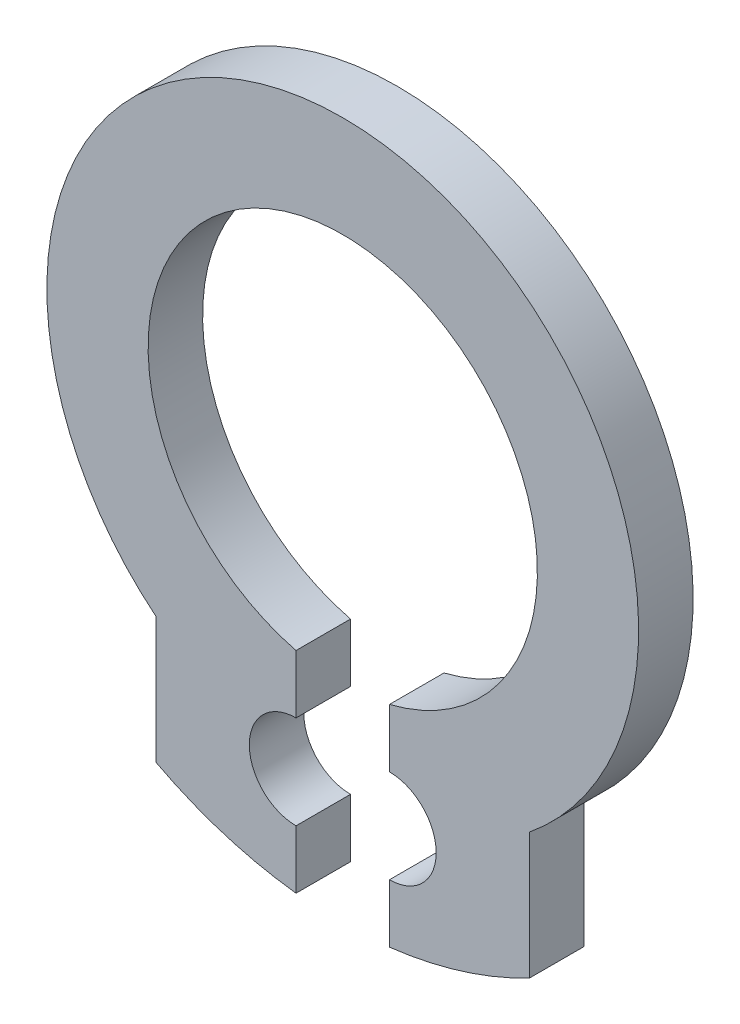
ISO-10303-21;
HEADER;
FILE_DESCRIPTION(('STEP AP214'),'2;1');
FILE_NAME('part.step','',(''),(''),'','','');
FILE_SCHEMA(('AUTOMOTIVE_DESIGN { 1 0 10303 214 1 1 1 1 }'));
ENDSEC;
DATA;
#1=APPLICATION_CONTEXT('core data for automotive mechanical design processes');
#2=APPLICATION_PROTOCOL_DEFINITION('international standard','automotive_design',2000,#1);
#3=PRODUCT_CONTEXT('',#1,'mechanical');
#4=PRODUCT('Part','Part','',(#3));
#5=PRODUCT_RELATED_PRODUCT_CATEGORY('part','',(#4));
#6=PRODUCT_DEFINITION_FORMATION('','',#4);
#7=PRODUCT_DEFINITION_CONTEXT('part definition',#1,'design');
#8=PRODUCT_DEFINITION('design','',#6,#7);
#9=PRODUCT_DEFINITION_SHAPE('','',#8);
#10=(LENGTH_UNIT() NAMED_UNIT(*) SI_UNIT(.MILLI.,.METRE.));
#11=(NAMED_UNIT(*) PLANE_ANGLE_UNIT() SI_UNIT($,.RADIAN.));
#12=(NAMED_UNIT(*) SI_UNIT($,.STERADIAN.) SOLID_ANGLE_UNIT());
#13=UNCERTAINTY_MEASURE_WITH_UNIT(LENGTH_MEASURE(1.E-05),#10,'distance_accuracy_value','');
#14=(GEOMETRIC_REPRESENTATION_CONTEXT(3) GLOBAL_UNCERTAINTY_ASSIGNED_CONTEXT((#13)) GLOBAL_UNIT_ASSIGNED_CONTEXT((#10,
#11,#12)) REPRESENTATION_CONTEXT('',''));
#15=CARTESIAN_POINT('',(0.,0.,0.));
#16=DIRECTION('',(0.,0.,1.));
#17=DIRECTION('',(1.,0.,0.));
#18=AXIS2_PLACEMENT_3D('',#15,#16,#17);
#19=CARTESIAN_POINT('',(0.,0.,0.));
#20=DIRECTION('',(0.,0.,1.));
#21=DIRECTION('',(1.,0.,0.));
#22=AXIS2_PLACEMENT_3D('',#19,#20,#21);
#23=PLANE('',#22);
#24=CARTESIAN_POINT('',(-0.6,5.126932219902,0.));
#25=DIRECTION('',(0.,0.,1.));
#26=DIRECTION('',(1.,0.,0.));
#27=AXIS2_PLACEMENT_3D('',#24,#25,#26);
#28=CIRCLE('',#27,2.5);
#29=CARTESIAN_POINT('',(0.,2.69999999999969,0.));
#30=VERTEX_POINT('',#29);
#31=CARTESIAN_POINT('',(-1.20000000000002,2.69999999999969,0.));
#32=VERTEX_POINT('',#31);
#33=EDGE_CURVE('E165',#30,#32,#28,.T.);
#34=ORIENTED_EDGE('',*,*,#33,.T.);
#35=DIRECTION('',(0.,1.,0.));
#36=VECTOR('',#35,1.);
#37=CARTESIAN_POINT('',(-1.2,0.,0.));
#38=LINE('',#37,#36);
#39=CARTESIAN_POINT('',(-1.2,1.95,0.));
#40=VERTEX_POINT('',#39);
#41=EDGE_CURVE('E129',#40,#32,#38,.T.);
#42=ORIENTED_EDGE('',*,*,#41,.F.);
#43=CARTESIAN_POINT('',(-1.2,1.35,0.));
#44=DIRECTION('',(0.,0.,1.));
#45=DIRECTION('',(1.,0.,0.));
#46=AXIS2_PLACEMENT_3D('',#43,#44,#45);
#47=CIRCLE('',#46,0.6);
#48=CARTESIAN_POINT('',(-1.2,0.75,0.));
#49=VERTEX_POINT('',#48);
#50=EDGE_CURVE('E167',#40,#49,#47,.T.);
#51=ORIENTED_EDGE('',*,*,#50,.T.);
#52=DIRECTION('',(0.,1.,0.));
#53=VECTOR('',#52,1.);
#54=CARTESIAN_POINT('',(-1.2,0.,0.));
#55=LINE('',#54,#53);
#56=CARTESIAN_POINT('',(-1.2,0.,0.));
#57=VERTEX_POINT('',#56);
#58=EDGE_CURVE('E132',#57,#49,#55,.T.);
#59=ORIENTED_EDGE('',*,*,#58,.F.);
#60=CARTESIAN_POINT('',(-0.6,5.126932219902,0.));
#61=DIRECTION('',(0.,0.,1.));
#62=DIRECTION('',(1.,0.,0.));
#63=AXIS2_PLACEMENT_3D('',#60,#61,#62);
#64=CIRCLE('',#63,5.161921540228);
#65=CARTESIAN_POINT('',(-3.,0.556873797138699,0.));
#66=VERTEX_POINT('',#65);
#67=EDGE_CURVE('E136',#66,#57,#64,.T.);
#68=ORIENTED_EDGE('',*,*,#67,.F.);
#69=DIRECTION('',(0.,1.,0.));
#70=VECTOR('',#69,1.);
#71=CARTESIAN_POINT('',(-3.,2.180748247371,0.));
#72=LINE('',#71,#70);
#73=CARTESIAN_POINT('',(-3.,2.18074824737081,0.));
#74=VERTEX_POINT('',#73);
#75=EDGE_CURVE('E137',#74,#66,#72,.F.);
#76=ORIENTED_EDGE('',*,*,#75,.F.);
#77=CARTESIAN_POINT('',(-0.6,5.126932219902,0.));
#78=DIRECTION('',(0.,0.,1.));
#79=DIRECTION('',(1.,0.,0.));
#80=AXIS2_PLACEMENT_3D('',#77,#78,#79);
#81=CIRCLE('',#80,3.8);
#82=CARTESIAN_POINT('',(1.80000000000003,2.18074824737078,0.));
#83=VERTEX_POINT('',#82);
#84=EDGE_CURVE('E172',#83,#74,#81,.T.);
#85=ORIENTED_EDGE('',*,*,#84,.F.);
#86=DIRECTION('',(0.,1.,0.));
#87=VECTOR('',#86,1.);
#88=CARTESIAN_POINT('',(1.8,0.5568737971387,0.));
#89=LINE('',#88,#87);
#90=CARTESIAN_POINT('',(1.8,0.556873797138699,0.));
#91=VERTEX_POINT('',#90);
#92=EDGE_CURVE('E141',#91,#83,#89,.T.);
#93=ORIENTED_EDGE('',*,*,#92,.F.);
#94=CARTESIAN_POINT('',(-0.6,5.126932219902,0.));
#95=DIRECTION('',(0.,0.,1.));
#96=DIRECTION('',(1.,0.,0.));
#97=AXIS2_PLACEMENT_3D('',#94,#95,#96);
#98=CIRCLE('',#97,5.161921540228);
#99=CARTESIAN_POINT('',(0.,0.,0.));
#100=VERTEX_POINT('',#99);
#101=EDGE_CURVE('E173',#100,#91,#98,.T.);
#102=ORIENTED_EDGE('',*,*,#101,.F.);
#103=DIRECTION('',(0.,1.,0.));
#104=VECTOR('',#103,1.);
#105=CARTESIAN_POINT('',(0.,2.7,0.));
#106=LINE('',#105,#104);
#107=CARTESIAN_POINT('',(0.,0.75,0.));
#108=VERTEX_POINT('',#107);
#109=EDGE_CURVE('E110',#108,#100,#106,.F.);
#110=ORIENTED_EDGE('',*,*,#109,.F.);
#111=CARTESIAN_POINT('',(0.,1.35,0.));
#112=DIRECTION('',(0.,0.,1.));
#113=DIRECTION('',(1.,0.,0.));
#114=AXIS2_PLACEMENT_3D('',#111,#112,#113);
#115=CIRCLE('',#114,0.6);
#116=CARTESIAN_POINT('',(0.,1.95,0.));
#117=VERTEX_POINT('',#116);
#118=EDGE_CURVE('E20',#108,#117,#115,.T.);
#119=ORIENTED_EDGE('',*,*,#118,.T.);
#120=DIRECTION('',(0.,1.,0.));
#121=VECTOR('',#120,1.);
#122=CARTESIAN_POINT('',(0.,2.7,0.));
#123=LINE('',#122,#121);
#124=EDGE_CURVE('E107',#30,#117,#123,.F.);
#125=ORIENTED_EDGE('',*,*,#124,.F.);
#126=EDGE_LOOP('',(#34,#42,#51,#59,#68,#76,#85,#93,#102,#110,#119,#125));
#127=FACE_BOUND('',#126,.T.);
#128=ADVANCED_FACE('F17',(#127),#23,.F.);
#129=CARTESIAN_POINT('',(0.,2.7,0.));
#130=DIRECTION('',(-1.,0.,0.));
#131=DIRECTION('',(0.,0.,1.));
#132=AXIS2_PLACEMENT_3D('',#129,#130,#131);
#133=PLANE('',#132);
#134=DIRECTION('',(0.,1.,0.));
#135=VECTOR('',#134,1.);
#136=CARTESIAN_POINT('',(0.,0.,0.7));
#137=LINE('',#136,#135);
#138=CARTESIAN_POINT('',(0.,2.69999999999969,0.7));
#139=VERTEX_POINT('',#138);
#140=CARTESIAN_POINT('',(0.,1.95,0.7));
#141=VERTEX_POINT('',#140);
#142=EDGE_CURVE('E164',#139,#141,#137,.F.);
#143=ORIENTED_EDGE('',*,*,#142,.F.);
#144=DIRECTION('',(0.,0.,1.));
#145=VECTOR('',#144,1.);
#146=CARTESIAN_POINT('',(0.,2.69999999999969,0.));
#147=LINE('',#146,#145);
#148=EDGE_CURVE('E119',#139,#30,#147,.F.);
#149=ORIENTED_EDGE('',*,*,#148,.T.);
#150=ORIENTED_EDGE('',*,*,#124,.T.);
#151=DIRECTION('',(0.,0.,1.));
#152=VECTOR('',#151,1.);
#153=CARTESIAN_POINT('',(0.,1.95,-0.07));
#154=LINE('',#153,#152);
#155=EDGE_CURVE('E113',#117,#141,#154,.T.);
#156=ORIENTED_EDGE('',*,*,#155,.T.);
#157=EDGE_LOOP('',(#143,#149,#150,#156));
#158=FACE_BOUND('',#157,.T.);
#159=ADVANCED_FACE('F116',(#158),#133,.T.);
#160=CARTESIAN_POINT('',(0.,1.35,-0.07));
#161=DIRECTION('',(0.,0.,1.));
#162=DIRECTION('',(1.,0.,0.));
#163=AXIS2_PLACEMENT_3D('',#160,#161,#162);
#164=CYLINDRICAL_SURFACE('',#163,0.6);
#165=ORIENTED_EDGE('',*,*,#118,.F.);
#166=DIRECTION('',(0.,0.,1.));
#167=VECTOR('',#166,1.);
#168=CARTESIAN_POINT('',(0.,0.75,0.));
#169=LINE('',#168,#167);
#170=CARTESIAN_POINT('',(0.,0.75,0.7));
#171=VERTEX_POINT('',#170);
#172=EDGE_CURVE('E112',#171,#108,#169,.F.);
#173=ORIENTED_EDGE('',*,*,#172,.F.);
#174=CARTESIAN_POINT('',(0.,1.35,0.7));
#175=DIRECTION('',(0.,0.,1.));
#176=DIRECTION('',(1.,0.,0.));
#177=AXIS2_PLACEMENT_3D('',#174,#175,#176);
#178=CIRCLE('',#177,0.6);
#179=EDGE_CURVE('E123',#141,#171,#178,.F.);
#180=ORIENTED_EDGE('',*,*,#179,.F.);
#181=ORIENTED_EDGE('',*,*,#155,.F.);
#182=EDGE_LOOP('',(#165,#173,#180,#181));
#183=FACE_BOUND('',#182,.T.);
#184=ADVANCED_FACE('F122',(#183),#164,.F.);
#185=CARTESIAN_POINT('',(0.,2.7,0.));
#186=DIRECTION('',(-1.,0.,0.));
#187=DIRECTION('',(0.,0.,1.));
#188=AXIS2_PLACEMENT_3D('',#185,#186,#187);
#189=PLANE('',#188);
#190=ORIENTED_EDGE('',*,*,#109,.T.);
#191=DIRECTION('',(0.,0.,1.));
#192=VECTOR('',#191,1.);
#193=CARTESIAN_POINT('',(0.,0.,0.));
#194=LINE('',#193,#192);
#195=CARTESIAN_POINT('',(0.,0.,0.7));
#196=VERTEX_POINT('',#195);
#197=EDGE_CURVE('E146',#196,#100,#194,.F.);
#198=ORIENTED_EDGE('',*,*,#197,.F.);
#199=DIRECTION('',(0.,1.,0.));
#200=VECTOR('',#199,1.);
#201=CARTESIAN_POINT('',(0.,0.,0.7));
#202=LINE('',#201,#200);
#203=EDGE_CURVE('E162',#171,#196,#202,.F.);
#204=ORIENTED_EDGE('',*,*,#203,.F.);
#205=ORIENTED_EDGE('',*,*,#172,.T.);
#206=EDGE_LOOP('',(#190,#198,#204,#205));
#207=FACE_BOUND('',#206,.T.);
#208=ADVANCED_FACE('F249',(#207),#189,.T.);
#209=CARTESIAN_POINT('',(-0.6,5.126932219902,0.));
#210=DIRECTION('',(0.,0.,1.));
#211=DIRECTION('',(1.,0.,0.));
#212=AXIS2_PLACEMENT_3D('',#209,#210,#211);
#213=CYLINDRICAL_SURFACE('',#212,5.161921540228);
#214=DIRECTION('',(0.,0.,-1.));
#215=VECTOR('',#214,1.);
#216=CARTESIAN_POINT('',(1.8,0.556873797138699,0.));
#217=LINE('',#216,#215);
#218=CARTESIAN_POINT('',(1.8,0.556873797138699,0.7));
#219=VERTEX_POINT('',#218);
#220=EDGE_CURVE('E145',#219,#91,#217,.T.);
#221=ORIENTED_EDGE('',*,*,#220,.F.);
#222=CARTESIAN_POINT('',(-0.6,5.126932219902,0.7));
#223=DIRECTION('',(0.,0.,1.));
#224=DIRECTION('',(1.,0.,0.));
#225=AXIS2_PLACEMENT_3D('',#222,#223,#224);
#226=CIRCLE('',#225,5.161921540228);
#227=EDGE_CURVE('E159',#196,#219,#226,.T.);
#228=ORIENTED_EDGE('',*,*,#227,.F.);
#229=ORIENTED_EDGE('',*,*,#197,.T.);
#230=ORIENTED_EDGE('',*,*,#101,.T.);
#231=EDGE_LOOP('',(#221,#228,#229,#230));
#232=FACE_BOUND('',#231,.T.);
#233=ADVANCED_FACE('F245',(#232),#213,.T.);
#234=CARTESIAN_POINT('',(1.8,0.5568737971387,0.));
#235=DIRECTION('',(1.,0.,0.));
#236=DIRECTION('',(0.,0.,-1.));
#237=AXIS2_PLACEMENT_3D('',#234,#235,#236);
#238=PLANE('',#237);
#239=DIRECTION('',(0.,0.,1.));
#240=VECTOR('',#239,1.);
#241=CARTESIAN_POINT('',(1.80000000000006,2.1807482473708,0.));
#242=LINE('',#241,#240);
#243=CARTESIAN_POINT('',(1.80000000000003,2.18074824737078,0.7));
#244=VERTEX_POINT('',#243);
#245=EDGE_CURVE('E144',#244,#83,#242,.F.);
#246=ORIENTED_EDGE('',*,*,#245,.F.);
#247=DIRECTION('',(0.,1.,0.));
#248=VECTOR('',#247,1.);
#249=CARTESIAN_POINT('',(1.8,0.,0.7));
#250=LINE('',#249,#248);
#251=EDGE_CURVE('E158',#219,#244,#250,.T.);
#252=ORIENTED_EDGE('',*,*,#251,.F.);
#253=ORIENTED_EDGE('',*,*,#220,.T.);
#254=ORIENTED_EDGE('',*,*,#92,.T.);
#255=EDGE_LOOP('',(#246,#252,#253,#254));
#256=FACE_BOUND('',#255,.T.);
#257=ADVANCED_FACE('F241',(#256),#238,.T.);
#258=CARTESIAN_POINT('',(-0.6,5.126932219902,0.));
#259=DIRECTION('',(0.,0.,1.));
#260=DIRECTION('',(1.,0.,0.));
#261=AXIS2_PLACEMENT_3D('',#258,#259,#260);
#262=CYLINDRICAL_SURFACE('',#261,3.8);
#263=DIRECTION('',(0.,0.,1.));
#264=VECTOR('',#263,1.);
#265=CARTESIAN_POINT('',(-3.,2.18074824737088,0.));
#266=LINE('',#265,#264);
#267=CARTESIAN_POINT('',(-3.,2.18074824737081,0.7));
#268=VERTEX_POINT('',#267);
#269=EDGE_CURVE('E140',#268,#74,#266,.F.);
#270=ORIENTED_EDGE('',*,*,#269,.F.);
#271=CARTESIAN_POINT('',(-0.6,5.126932219902,0.7));
#272=DIRECTION('',(0.,0.,1.));
#273=DIRECTION('',(1.,0.,0.));
#274=AXIS2_PLACEMENT_3D('',#271,#272,#273);
#275=CIRCLE('',#274,3.8);
#276=EDGE_CURVE('E156',#244,#268,#275,.T.);
#277=ORIENTED_EDGE('',*,*,#276,.F.);
#278=ORIENTED_EDGE('',*,*,#245,.T.);
#279=ORIENTED_EDGE('',*,*,#84,.T.);
#280=EDGE_LOOP('',(#270,#277,#278,#279));
#281=FACE_BOUND('',#280,.T.);
#282=ADVANCED_FACE('F237',(#281),#262,.T.);
#283=CARTESIAN_POINT('',(-3.,2.180748247371,0.));
#284=DIRECTION('',(-1.,0.,0.));
#285=DIRECTION('',(0.,0.,1.));
#286=AXIS2_PLACEMENT_3D('',#283,#284,#285);
#287=PLANE('',#286);
#288=DIRECTION('',(0.,0.,1.));
#289=VECTOR('',#288,1.);
#290=CARTESIAN_POINT('',(-3.,0.556873797138699,0.));
#291=LINE('',#290,#289);
#292=CARTESIAN_POINT('',(-3.,0.556873797138699,0.7));
#293=VERTEX_POINT('',#292);
#294=EDGE_CURVE('E139',#293,#66,#291,.F.);
#295=ORIENTED_EDGE('',*,*,#294,.F.);
#296=DIRECTION('',(0.,1.,0.));
#297=VECTOR('',#296,1.);
#298=CARTESIAN_POINT('',(-3.,0.,0.7));
#299=LINE('',#298,#297);
#300=EDGE_CURVE('E155',#268,#293,#299,.F.);
#301=ORIENTED_EDGE('',*,*,#300,.F.);
#302=ORIENTED_EDGE('',*,*,#269,.T.);
#303=ORIENTED_EDGE('',*,*,#75,.T.);
#304=EDGE_LOOP('',(#295,#301,#302,#303));
#305=FACE_BOUND('',#304,.T.);
#306=ADVANCED_FACE('F233',(#305),#287,.T.);
#307=CARTESIAN_POINT('',(-0.6,5.126932219902,0.));
#308=DIRECTION('',(0.,0.,1.));
#309=DIRECTION('',(1.,0.,0.));
#310=AXIS2_PLACEMENT_3D('',#307,#308,#309);
#311=CYLINDRICAL_SURFACE('',#310,5.161921540228);
#312=DIRECTION('',(0.,0.,-1.));
#313=VECTOR('',#312,1.);
#314=CARTESIAN_POINT('',(-1.2,0.,0.));
#315=LINE('',#314,#313);
#316=CARTESIAN_POINT('',(-1.2,0.,0.7));
#317=VERTEX_POINT('',#316);
#318=EDGE_CURVE('E135',#317,#57,#315,.T.);
#319=ORIENTED_EDGE('',*,*,#318,.F.);
#320=CARTESIAN_POINT('',(-0.6,5.126932219902,0.7));
#321=DIRECTION('',(0.,0.,1.));
#322=DIRECTION('',(1.,0.,0.));
#323=AXIS2_PLACEMENT_3D('',#320,#321,#322);
#324=CIRCLE('',#323,5.161921540228);
#325=EDGE_CURVE('E152',#293,#317,#324,.T.);
#326=ORIENTED_EDGE('',*,*,#325,.F.);
#327=ORIENTED_EDGE('',*,*,#294,.T.);
#328=ORIENTED_EDGE('',*,*,#67,.T.);
#329=EDGE_LOOP('',(#319,#326,#327,#328));
#330=FACE_BOUND('',#329,.T.);
#331=ADVANCED_FACE('F229',(#330),#311,.T.);
#332=CARTESIAN_POINT('',(-1.2,0.,0.));
#333=DIRECTION('',(1.,0.,0.));
#334=DIRECTION('',(0.,0.,-1.));
#335=AXIS2_PLACEMENT_3D('',#332,#333,#334);
#336=PLANE('',#335);
#337=DIRECTION('',(0.,1.,0.));
#338=VECTOR('',#337,1.);
#339=CARTESIAN_POINT('',(-1.2,0.,0.7));
#340=LINE('',#339,#338);
#341=CARTESIAN_POINT('',(-1.2,0.75,0.7));
#342=VERTEX_POINT('',#341);
#343=EDGE_CURVE('E151',#317,#342,#340,.T.);
#344=ORIENTED_EDGE('',*,*,#343,.F.);
#345=ORIENTED_EDGE('',*,*,#318,.T.);
#346=ORIENTED_EDGE('',*,*,#58,.T.);
#347=DIRECTION('',(0.,0.,1.));
#348=VECTOR('',#347,1.);
#349=CARTESIAN_POINT('',(-1.2,0.75,-0.07));
#350=LINE('',#349,#348);
#351=EDGE_CURVE('E169',#49,#342,#350,.T.);
#352=ORIENTED_EDGE('',*,*,#351,.T.);
#353=EDGE_LOOP('',(#344,#345,#346,#352));
#354=FACE_BOUND('',#353,.T.);
#355=ADVANCED_FACE('F226',(#354),#336,.T.);
#356=CARTESIAN_POINT('',(-1.2,1.35,-0.07));
#357=DIRECTION('',(0.,0.,1.));
#358=DIRECTION('',(1.,0.,0.));
#359=AXIS2_PLACEMENT_3D('',#356,#357,#358);
#360=CYLINDRICAL_SURFACE('',#359,0.6);
#361=ORIENTED_EDGE('',*,*,#351,.F.);
#362=ORIENTED_EDGE('',*,*,#50,.F.);
#363=DIRECTION('',(0.,0.,-1.));
#364=VECTOR('',#363,1.);
#365=CARTESIAN_POINT('',(-1.2,1.95,0.));
#366=LINE('',#365,#364);
#367=CARTESIAN_POINT('',(-1.2,1.95,0.7));
#368=VERTEX_POINT('',#367);
#369=EDGE_CURVE('E131',#368,#40,#366,.T.);
#370=ORIENTED_EDGE('',*,*,#369,.F.);
#371=CARTESIAN_POINT('',(-1.2,1.35,0.7));
#372=DIRECTION('',(0.,0.,1.));
#373=DIRECTION('',(1.,0.,0.));
#374=AXIS2_PLACEMENT_3D('',#371,#372,#373);
#375=CIRCLE('',#374,0.6);
#376=EDGE_CURVE('E148',#342,#368,#375,.F.);
#377=ORIENTED_EDGE('',*,*,#376,.F.);
#378=EDGE_LOOP('',(#361,#362,#370,#377));
#379=FACE_BOUND('',#378,.T.);
#380=ADVANCED_FACE('F211',(#379),#360,.F.);
#381=CARTESIAN_POINT('',(-1.2,0.,0.));
#382=DIRECTION('',(1.,0.,0.));
#383=DIRECTION('',(0.,0.,-1.));
#384=AXIS2_PLACEMENT_3D('',#381,#382,#383);
#385=PLANE('',#384);
#386=ORIENTED_EDGE('',*,*,#41,.T.);
#387=DIRECTION('',(0.,0.,1.));
#388=VECTOR('',#387,1.);
#389=CARTESIAN_POINT('',(-1.20000000000004,2.69999999999969,0.));
#390=LINE('',#389,#388);
#391=CARTESIAN_POINT('',(-1.20000000000002,2.69999999999969,0.7));
#392=VERTEX_POINT('',#391);
#393=EDGE_CURVE('E35',#32,#392,#390,.T.);
#394=ORIENTED_EDGE('',*,*,#393,.T.);
#395=DIRECTION('',(0.,1.,0.));
#396=VECTOR('',#395,1.);
#397=CARTESIAN_POINT('',(-1.2,0.,0.7));
#398=LINE('',#397,#396);
#399=EDGE_CURVE('E26',#368,#392,#398,.T.);
#400=ORIENTED_EDGE('',*,*,#399,.F.);
#401=ORIENTED_EDGE('',*,*,#369,.T.);
#402=EDGE_LOOP('',(#386,#394,#400,#401));
#403=FACE_BOUND('',#402,.T.);
#404=ADVANCED_FACE('F207',(#403),#385,.T.);
#405=CARTESIAN_POINT('',(-0.6,5.126932219902,0.));
#406=DIRECTION('',(0.,0.,1.));
#407=DIRECTION('',(1.,0.,0.));
#408=AXIS2_PLACEMENT_3D('',#405,#406,#407);
#409=CYLINDRICAL_SURFACE('',#408,2.5);
#410=ORIENTED_EDGE('',*,*,#33,.F.);
#411=ORIENTED_EDGE('',*,*,#148,.F.);
#412=CARTESIAN_POINT('',(-0.6,5.126932219902,0.7));
#413=DIRECTION('',(0.,0.,1.));
#414=DIRECTION('',(1.,0.,0.));
#415=AXIS2_PLACEMENT_3D('',#412,#413,#414);
#416=CIRCLE('',#415,2.5);
#417=EDGE_CURVE('E11',#392,#139,#416,.F.);
#418=ORIENTED_EDGE('',*,*,#417,.F.);
#419=ORIENTED_EDGE('',*,*,#393,.F.);
#420=EDGE_LOOP('',(#410,#411,#418,#419));
#421=FACE_BOUND('',#420,.T.);
#422=ADVANCED_FACE('F213',(#421),#409,.F.);
#423=CARTESIAN_POINT('',(0.,0.,0.7));
#424=DIRECTION('',(0.,0.,1.));
#425=DIRECTION('',(1.,0.,0.));
#426=AXIS2_PLACEMENT_3D('',#423,#424,#425);
#427=PLANE('',#426);
#428=ORIENTED_EDGE('',*,*,#417,.T.);
#429=ORIENTED_EDGE('',*,*,#142,.T.);
#430=ORIENTED_EDGE('',*,*,#179,.T.);
#431=ORIENTED_EDGE('',*,*,#203,.T.);
#432=ORIENTED_EDGE('',*,*,#227,.T.);
#433=ORIENTED_EDGE('',*,*,#251,.T.);
#434=ORIENTED_EDGE('',*,*,#276,.T.);
#435=ORIENTED_EDGE('',*,*,#300,.T.);
#436=ORIENTED_EDGE('',*,*,#325,.T.);
#437=ORIENTED_EDGE('',*,*,#343,.T.);
#438=ORIENTED_EDGE('',*,*,#376,.T.);
#439=ORIENTED_EDGE('',*,*,#399,.T.);
#440=EDGE_LOOP('',(#428,#429,#430,#431,#432,#433,#434,#435,#436,#437,#438,#439));
#441=FACE_BOUND('',#440,.T.);
#442=ADVANCED_FACE('F205',(#441),#427,.T.);
#443=CLOSED_SHELL('',(#128,#159,#184,#208,#233,#257,#282,#306,#331,#355,#380,#404,#422,#442));
#444=MANIFOLD_SOLID_BREP('B1',#443);
#445=ADVANCED_BREP_SHAPE_REPRESENTATION('',(#18,#444),#14);
#446=SHAPE_DEFINITION_REPRESENTATION(#9,#445);
ENDSEC;
END-ISO-10303-21;
